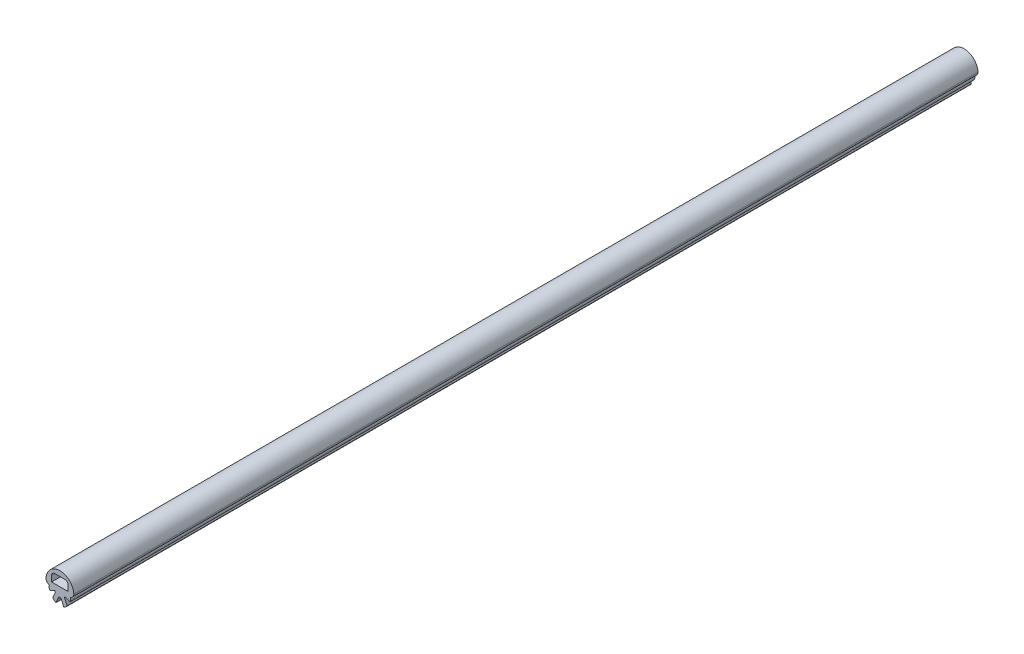
ISO-10303-21;
HEADER;
FILE_DESCRIPTION(('STEP AP214'),'2;1');
FILE_NAME('part.step','',(''),(''),'','','');
FILE_SCHEMA(('AUTOMOTIVE_DESIGN { 1 0 10303 214 1 1 1 1 }'));
ENDSEC;
DATA;
#1=APPLICATION_CONTEXT('core data for automotive mechanical design processes');
#2=APPLICATION_PROTOCOL_DEFINITION('international standard','automotive_design',2000,#1);
#3=PRODUCT_CONTEXT('',#1,'mechanical');
#4=PRODUCT('Part','Part','',(#3));
#5=PRODUCT_RELATED_PRODUCT_CATEGORY('part','',(#4));
#6=PRODUCT_DEFINITION_FORMATION('','',#4);
#7=PRODUCT_DEFINITION_CONTEXT('part definition',#1,'design');
#8=PRODUCT_DEFINITION('design','',#6,#7);
#9=PRODUCT_DEFINITION_SHAPE('','',#8);
#10=(LENGTH_UNIT() NAMED_UNIT(*) SI_UNIT(.MILLI.,.METRE.));
#11=(NAMED_UNIT(*) PLANE_ANGLE_UNIT() SI_UNIT($,.RADIAN.));
#12=(NAMED_UNIT(*) SI_UNIT($,.STERADIAN.) SOLID_ANGLE_UNIT());
#13=UNCERTAINTY_MEASURE_WITH_UNIT(LENGTH_MEASURE(1.E-05),#10,'distance_accuracy_value','');
#14=(GEOMETRIC_REPRESENTATION_CONTEXT(3) GLOBAL_UNCERTAINTY_ASSIGNED_CONTEXT((#13)) GLOBAL_UNIT_ASSIGNED_CONTEXT((#10,
#11,#12)) REPRESENTATION_CONTEXT('',''));
#15=CARTESIAN_POINT('',(0.,0.,0.));
#16=DIRECTION('',(0.,0.,1.));
#17=DIRECTION('',(1.,0.,0.));
#18=AXIS2_PLACEMENT_3D('',#15,#16,#17);
#19=CARTESIAN_POINT('',(-6.47113248654049,-11.6533832902364,17.5643148085863));
#20=DIRECTION('',(-0.866025403784436,-0.500000000000005,0.));
#21=DIRECTION('',(0.500000000000005,-0.866025403784436,0.));
#22=AXIS2_PLACEMENT_3D('',#19,#20,#21);
#23=PLANE('',#22);
#24=DIRECTION('',(0.,0.,-1.));
#25=VECTOR('',#24,1.);
#26=CARTESIAN_POINT('',(-8.95886950491573,-7.34449637854067,17.5643148085863));
#27=LINE('',#26,#25);
#28=CARTESIAN_POINT('',(-8.95886950491573,-7.34449637854067,-57.));
#29=VERTEX_POINT('',#28);
#30=CARTESIAN_POINT('',(-8.95886950491573,-7.34449637854067,-870.));
#31=VERTEX_POINT('',#30);
#32=EDGE_CURVE('E402',#29,#31,#27,.T.);
#33=ORIENTED_EDGE('',*,*,#32,.F.);
#34=DIRECTION('',(-0.500000000000005,0.866025403784436,0.));
#35=VECTOR('',#34,1.);
#36=CARTESIAN_POINT('',(-6.47113248654049,-11.6533832902364,-57.));
#37=LINE('',#36,#35);
#38=CARTESIAN_POINT('',(-9.20528257003529,-6.91769643010482,-57.));
#39=VERTEX_POINT('',#38);
#40=EDGE_CURVE('E334',#29,#39,#37,.T.);
#41=ORIENTED_EDGE('',*,*,#40,.T.);
#42=DIRECTION('',(0.,0.,-1.));
#43=VECTOR('',#42,1.);
#44=CARTESIAN_POINT('',(-9.20528257003529,-6.91769643010482,17.5643148085863));
#45=LINE('',#44,#43);
#46=CARTESIAN_POINT('',(-9.20528257003529,-6.91769643010482,-870.));
#47=VERTEX_POINT('',#46);
#48=EDGE_CURVE('E336',#39,#47,#45,.T.);
#49=ORIENTED_EDGE('',*,*,#48,.T.);
#50=DIRECTION('',(-0.500000000000005,0.866025403784436,0.));
#51=VECTOR('',#50,1.);
#52=CARTESIAN_POINT('',(-6.47113248654049,-11.6533832902364,-870.));
#53=LINE('',#52,#51);
#54=EDGE_CURVE('E373',#31,#47,#53,.T.);
#55=ORIENTED_EDGE('',*,*,#54,.F.);
#56=EDGE_LOOP('',(#33,#41,#49,#55));
#57=FACE_BOUND('',#56,.T.);
#58=ADVANCED_FACE('F49',(#57),#23,.T.);
#59=CARTESIAN_POINT('',(9.20528257003505,-6.91769643010493,17.5643148085863));
#60=DIRECTION('',(0.866025403784431,-0.500000000000013,0.));
#61=DIRECTION('',(0.500000000000013,0.866025403784431,0.));
#62=AXIS2_PLACEMENT_3D('',#59,#60,#61);
#63=PLANE('',#62);
#64=DIRECTION('',(0.,0.,1.));
#65=VECTOR('',#64,1.);
#66=CARTESIAN_POINT('',(8.95886950491558,-7.3444963785406,17.5643148085863));
#67=LINE('',#66,#65);
#68=CARTESIAN_POINT('',(8.95886950491558,-7.3444963785406,-870.));
#69=VERTEX_POINT('',#68);
#70=CARTESIAN_POINT('',(8.95886950491558,-7.3444963785406,-57.));
#71=VERTEX_POINT('',#70);
#72=EDGE_CURVE('E396',#69,#71,#67,.T.);
#73=ORIENTED_EDGE('',*,*,#72,.F.);
#74=DIRECTION('',(-0.500000000000013,-0.866025403784431,0.));
#75=VECTOR('',#74,1.);
#76=CARTESIAN_POINT('',(9.20528257003505,-6.91769643010493,-870.));
#77=LINE('',#76,#75);
#78=CARTESIAN_POINT('',(9.20528257003505,-6.91769643010492,-870.));
#79=VERTEX_POINT('',#78);
#80=EDGE_CURVE('E365',#79,#69,#77,.T.);
#81=ORIENTED_EDGE('',*,*,#80,.F.);
#82=DIRECTION('',(0.,0.,-1.));
#83=VECTOR('',#82,1.);
#84=CARTESIAN_POINT('',(9.20528257003505,-6.91769643010492,17.5643148085863));
#85=LINE('',#84,#83);
#86=CARTESIAN_POINT('',(9.20528257003505,-6.91769643010492,-57.));
#87=VERTEX_POINT('',#86);
#88=EDGE_CURVE('E322',#87,#79,#85,.T.);
#89=ORIENTED_EDGE('',*,*,#88,.F.);
#90=DIRECTION('',(-0.500000000000013,-0.866025403784431,0.));
#91=VECTOR('',#90,1.);
#92=CARTESIAN_POINT('',(9.20528257003505,-6.91769643010493,-57.));
#93=LINE('',#92,#91);
#94=EDGE_CURVE('E330',#87,#71,#93,.T.);
#95=ORIENTED_EDGE('',*,*,#94,.T.);
#96=EDGE_LOOP('',(#73,#81,#89,#95));
#97=FACE_BOUND('',#96,.T.);
#98=ADVANCED_FACE('F438',(#97),#63,.T.);
#99=CARTESIAN_POINT('',(8.50059730669662,0.499492278712982,17.5643148085863));
#100=DIRECTION('',(0.,0.,-1.));
#101=DIRECTION('',(-1.,0.,0.));
#102=AXIS2_PLACEMENT_3D('',#99,#100,#101);
#103=CYLINDRICAL_SURFACE('',#102,4.00000000000114);
#104=DIRECTION('',(0.,0.,-1.));
#105=VECTOR('',#104,1.);
#106=CARTESIAN_POINT('',(12.4961385352011,0.310679431347746,-463.5));
#107=LINE('',#106,#105);
#108=CARTESIAN_POINT('',(12.4961385352011,0.310679431347746,-57.));
#109=VERTEX_POINT('',#108);
#110=CARTESIAN_POINT('',(12.4961385352011,0.310679431347746,-870.));
#111=VERTEX_POINT('',#110);
#112=EDGE_CURVE('E343',#109,#111,#107,.T.);
#113=ORIENTED_EDGE('',*,*,#112,.F.);
#114=CARTESIAN_POINT('',(8.50059730669662,0.499492278712982,-57.));
#115=DIRECTION('',(0.,0.,1.));
#116=DIRECTION('',(1.,0.,0.));
#117=AXIS2_PLACEMENT_3D('',#114,#115,#116);
#118=CIRCLE('',#117,4.00000000000114);
#119=CARTESIAN_POINT('',(9.43762749865645,-3.38920601497925,-57.));
#120=VERTEX_POINT('',#119);
#121=EDGE_CURVE('E313',#109,#120,#118,.F.);
#122=ORIENTED_EDGE('',*,*,#121,.T.);
#123=DIRECTION('',(0.,0.,-1.));
#124=VECTOR('',#123,1.);
#125=CARTESIAN_POINT('',(9.43762749865645,-3.38920601497925,17.5643148085863));
#126=LINE('',#125,#124);
#127=CARTESIAN_POINT('',(9.43762749865645,-3.38920601497925,-870.));
#128=VERTEX_POINT('',#127);
#129=EDGE_CURVE('E318',#120,#128,#126,.T.);
#130=ORIENTED_EDGE('',*,*,#129,.T.);
#131=CARTESIAN_POINT('',(8.50059730669662,0.499492278712982,-870.));
#132=DIRECTION('',(0.,0.,-1.));
#133=DIRECTION('',(-1.,0.,0.));
#134=AXIS2_PLACEMENT_3D('',#131,#132,#133);
#135=CIRCLE('',#134,4.00000000000114);
#136=EDGE_CURVE('E359',#111,#128,#135,.T.);
#137=ORIENTED_EDGE('',*,*,#136,.F.);
#138=EDGE_LOOP('',(#113,#122,#130,#137));
#139=FACE_BOUND('',#138,.T.);
#140=ADVANCED_FACE('F445',(#139),#103,.T.);
#141=CARTESIAN_POINT('',(-8.50059730669262,0.499492278712978,17.5643148085863));
#142=DIRECTION('',(0.,0.,-1.));
#143=DIRECTION('',(-1.,0.,0.));
#144=AXIS2_PLACEMENT_3D('',#141,#142,#143);
#145=CYLINDRICAL_SURFACE('',#144,4.00000000000114);
#146=DIRECTION('',(0.,0.,-1.));
#147=VECTOR('',#146,1.);
#148=CARTESIAN_POINT('',(-12.4961385351997,0.310679431403244,-463.5));
#149=LINE('',#148,#147);
#150=CARTESIAN_POINT('',(-12.4961385351997,0.310679431403244,-870.));
#151=VERTEX_POINT('',#150);
#152=CARTESIAN_POINT('',(-12.4961385351997,0.310679431403244,-57.));
#153=VERTEX_POINT('',#152);
#154=EDGE_CURVE('E317',#151,#153,#149,.F.);
#155=ORIENTED_EDGE('',*,*,#154,.F.);
#156=CARTESIAN_POINT('',(-8.50059730669262,0.499492278712978,-870.));
#157=DIRECTION('',(0.,0.,-1.));
#158=DIRECTION('',(-1.,0.,0.));
#159=AXIS2_PLACEMENT_3D('',#156,#157,#158);
#160=CIRCLE('',#159,4.00000000000114);
#161=CARTESIAN_POINT('',(-9.43762749865635,-3.38920601497831,-870.));
#162=VERTEX_POINT('',#161);
#163=EDGE_CURVE('E347',#162,#151,#160,.T.);
#164=ORIENTED_EDGE('',*,*,#163,.F.);
#165=DIRECTION('',(0.,0.,-1.));
#166=VECTOR('',#165,1.);
#167=CARTESIAN_POINT('',(-9.43762749865635,-3.38920601497831,17.5643148085863));
#168=LINE('',#167,#166);
#169=CARTESIAN_POINT('',(-9.43762749865635,-3.38920601497831,-57.));
#170=VERTEX_POINT('',#169);
#171=EDGE_CURVE('E341',#170,#162,#168,.T.);
#172=ORIENTED_EDGE('',*,*,#171,.F.);
#173=CARTESIAN_POINT('',(-8.50059730669262,0.499492278712978,-57.));
#174=DIRECTION('',(0.,0.,1.));
#175=DIRECTION('',(1.,0.,0.));
#176=AXIS2_PLACEMENT_3D('',#173,#174,#175);
#177=CIRCLE('',#176,4.00000000000114);
#178=EDGE_CURVE('E321',#170,#153,#177,.F.);
#179=ORIENTED_EDGE('',*,*,#178,.T.);
#180=EDGE_LOOP('',(#155,#164,#172,#179));
#181=FACE_BOUND('',#180,.T.);
#182=ADVANCED_FACE('F51',(#181),#145,.T.);
#183=CARTESIAN_POINT('',(-5.49999999999569,-1.50000000000011,-870.));
#184=DIRECTION('',(0.,0.,-1.));
#185=DIRECTION('',(-1.,0.,0.));
#186=AXIS2_PLACEMENT_3D('',#183,#184,#185);
#187=PLANE('',#186);
#188=DIRECTION('',(0.,-1.,0.));
#189=VECTOR('',#188,1.);
#190=CARTESIAN_POINT('',(7.5,0.,-870.));
#191=LINE('',#190,#189);
#192=CARTESIAN_POINT('',(7.5,4.99999999999998,-870.));
#193=VERTEX_POINT('',#192);
#194=CARTESIAN_POINT('',(7.5,0.,-870.));
#195=VERTEX_POINT('',#194);
#196=EDGE_CURVE('E64',#193,#195,#191,.T.);
#197=ORIENTED_EDGE('',*,*,#196,.F.);
#198=CARTESIAN_POINT('',(4.5,5.,-870.));
#199=DIRECTION('',(0.,0.,-1.));
#200=DIRECTION('',(1.,0.,0.));
#201=AXIS2_PLACEMENT_3D('',#198,#199,#200);
#202=CIRCLE('',#201,3.);
#203=CARTESIAN_POINT('',(4.49999999999998,8.,-870.));
#204=VERTEX_POINT('',#203);
#205=EDGE_CURVE('E249',#204,#193,#202,.T.);
#206=ORIENTED_EDGE('',*,*,#205,.F.);
#207=DIRECTION('',(1.,0.,0.));
#208=VECTOR('',#207,1.);
#209=CARTESIAN_POINT('',(4.49999999999998,8.,-870.));
#210=LINE('',#209,#208);
#211=CARTESIAN_POINT('',(-4.49999999999998,8.,-870.));
#212=VERTEX_POINT('',#211);
#213=EDGE_CURVE('E243',#212,#204,#210,.T.);
#214=ORIENTED_EDGE('',*,*,#213,.F.);
#215=CARTESIAN_POINT('',(-4.5,5.,-870.));
#216=DIRECTION('',(0.,0.,-1.));
#217=DIRECTION('',(1.,0.,0.));
#218=AXIS2_PLACEMENT_3D('',#215,#216,#217);
#219=CIRCLE('',#218,3.);
#220=CARTESIAN_POINT('',(-7.5,4.99999999999998,-870.));
#221=VERTEX_POINT('',#220);
#222=EDGE_CURVE('E241',#221,#212,#219,.T.);
#223=ORIENTED_EDGE('',*,*,#222,.F.);
#224=DIRECTION('',(0.,1.,0.));
#225=VECTOR('',#224,1.);
#226=CARTESIAN_POINT('',(-7.5,0.,-870.));
#227=LINE('',#226,#225);
#228=CARTESIAN_POINT('',(-7.5,0.,-870.));
#229=VERTEX_POINT('',#228);
#230=EDGE_CURVE('E224',#229,#221,#227,.T.);
#231=ORIENTED_EDGE('',*,*,#230,.F.);
#232=DIRECTION('',(-1.,0.,0.));
#233=VECTOR('',#232,1.);
#234=CARTESIAN_POINT('',(7.5,0.,-870.));
#235=LINE('',#234,#233);
#236=EDGE_CURVE('E233',#195,#229,#235,.T.);
#237=ORIENTED_EDGE('',*,*,#236,.F.);
#238=EDGE_LOOP('',(#197,#206,#214,#223,#231,#237));
#239=FACE_BOUND('',#238,.T.);
#240=DIRECTION('',(0.910826243995696,0.412789962630747,0.));
#241=VECTOR('',#240,1.);
#242=CARTESIAN_POINT('',(-9.08644720520006,-7.40231508378774,-870.));
#243=LINE('',#242,#241);
#244=CARTESIAN_POINT('',(-4.53231598522158,-5.33836527063401,-870.));
#245=VERTEX_POINT('',#244);
#246=EDGE_CURVE('E265',#31,#245,#243,.T.);
#247=ORIENTED_EDGE('',*,*,#246,.F.);
#248=ORIENTED_EDGE('',*,*,#54,.T.);
#249=CARTESIAN_POINT('',(-5.74118095489754,-4.9176964301048,-870.));
#250=DIRECTION('',(0.,0.,-1.));
#251=DIRECTION('',(-1.,0.,0.));
#252=AXIS2_PLACEMENT_3D('',#249,#250,#251);
#253=CIRCLE('',#252,4.);
#254=EDGE_CURVE('E377',#47,#162,#253,.T.);
#255=ORIENTED_EDGE('',*,*,#254,.T.);
#256=ORIENTED_EDGE('',*,*,#163,.T.);
#257=CARTESIAN_POINT('',(0.,0.,-870.));
#258=DIRECTION('',(0.,0.,1.));
#259=DIRECTION('',(-1.,0.,0.));
#260=AXIS2_PLACEMENT_3D('',#257,#258,#259);
#261=CIRCLE('',#260,12.5);
#262=EDGE_CURVE('E383',#111,#151,#261,.T.);
#263=ORIENTED_EDGE('',*,*,#262,.F.);
#264=ORIENTED_EDGE('',*,*,#136,.T.);
#265=CARTESIAN_POINT('',(5.7411809548973,-4.91769643010491,-870.));
#266=DIRECTION('',(0.,0.,-1.));
#267=DIRECTION('',(-1.,0.,0.));
#268=AXIS2_PLACEMENT_3D('',#265,#266,#267);
#269=CIRCLE('',#268,4.);
#270=EDGE_CURVE('E361',#128,#79,#269,.T.);
#271=ORIENTED_EDGE('',*,*,#270,.T.);
#272=ORIENTED_EDGE('',*,*,#80,.T.);
#273=DIRECTION('',(0.910826243995696,-0.412789962630747,0.));
#274=VECTOR('',#273,1.);
#275=CARTESIAN_POINT('',(9.08644720520006,-7.40231508378774,-870.));
#276=LINE('',#275,#274);
#277=CARTESIAN_POINT('',(4.53231598522158,-5.33836527063401,-870.));
#278=VERTEX_POINT('',#277);
#279=EDGE_CURVE('E282',#278,#69,#276,.T.);
#280=ORIENTED_EDGE('',*,*,#279,.F.);
#281=DIRECTION('',(0.412789962630747,0.910826243995696,0.));
#282=VECTOR('',#281,1.);
#283=CARTESIAN_POINT('',(4.53231598522158,-5.33836527063401,-870.));
#284=LINE('',#283,#282);
#285=CARTESIAN_POINT('',(4.11952602259083,-6.24919151462971,-870.));
#286=VERTEX_POINT('',#285);
#287=EDGE_CURVE('E279',#286,#278,#284,.T.);
#288=ORIENTED_EDGE('',*,*,#287,.F.);
#289=DIRECTION('',(-0.408909590842513,0.912574899127194,0.));
#290=VECTOR('',#289,1.);
#291=CARTESIAN_POINT('',(4.11952602259083,-6.24919151462971,-870.));
#292=LINE('',#291,#290);
#293=CARTESIAN_POINT('',(6.51050054542626,-11.5851958120505,-870.));
#294=VERTEX_POINT('',#293);
#295=EDGE_CURVE('E276',#294,#286,#292,.T.);
#296=ORIENTED_EDGE('',*,*,#295,.F.);
#297=CARTESIAN_POINT('',(6.47113248654022,-11.6533832902365,-870.));
#298=VERTEX_POINT('',#297);
#299=EDGE_CURVE('E364',#294,#298,#77,.T.);
#300=ORIENTED_EDGE('',*,*,#299,.T.);
#301=CARTESIAN_POINT('',(1.70799276572585,-8.90338329023642,-870.));
#302=DIRECTION('',(0.,0.,-1.));
#303=DIRECTION('',(-1.,0.,0.));
#304=AXIS2_PLACEMENT_3D('',#301,#302,#303);
#305=CIRCLE('',#304,5.5);
#306=CARTESIAN_POINT('',(3.49999999999998,-14.1032592572484,-870.));
#307=VERTEX_POINT('',#306);
#308=EDGE_CURVE('E368',#298,#307,#305,.T.);
#309=ORIENTED_EDGE('',*,*,#308,.T.);
#310=DIRECTION('',(0.401668825352325,-0.915784993729469,0.));
#311=VECTOR('',#310,1.);
#312=CARTESIAN_POINT('',(-2.5880522620679,-0.222802147458822,-870.));
#313=LINE('',#312,#311);
#314=CARTESIAN_POINT('',(0.999999999999997,-8.40338329023642,-870.));
#315=VERTEX_POINT('',#314);
#316=EDGE_CURVE('E307',#315,#307,#313,.T.);
#317=ORIENTED_EDGE('',*,*,#316,.F.);
#318=DIRECTION('',(1.,0.,0.));
#319=VECTOR('',#318,1.);
#320=CARTESIAN_POINT('',(-5.49999999999569,-8.40338329023642,-870.));
#321=LINE('',#320,#319);
#322=CARTESIAN_POINT('',(-1.,-8.40338329023642,-870.));
#323=VERTEX_POINT('',#322);
#324=EDGE_CURVE('E310',#323,#315,#321,.T.);
#325=ORIENTED_EDGE('',*,*,#324,.F.);
#326=DIRECTION('',(0.401668825352324,0.91578499372947,0.));
#327=VECTOR('',#326,1.);
#328=CARTESIAN_POINT('',(0.813335964210202,-4.26906725722826,-870.));
#329=LINE('',#328,#327);
#330=CARTESIAN_POINT('',(-3.50000000000002,-14.1032592572485,-870.));
#331=VERTEX_POINT('',#330);
#332=EDGE_CURVE('E301',#331,#323,#329,.T.);
#333=ORIENTED_EDGE('',*,*,#332,.F.);
#334=CARTESIAN_POINT('',(-1.70799276572609,-8.90338329023643,-870.));
#335=DIRECTION('',(0.,0.,-1.));
#336=DIRECTION('',(-1.,0.,0.));
#337=AXIS2_PLACEMENT_3D('',#334,#335,#336);
#338=CIRCLE('',#337,5.49999999999999);
#339=CARTESIAN_POINT('',(-6.47113248654049,-11.6533832902364,-870.));
#340=VERTEX_POINT('',#339);
#341=EDGE_CURVE('E371',#331,#340,#338,.T.);
#342=ORIENTED_EDGE('',*,*,#341,.T.);
#343=CARTESIAN_POINT('',(-6.51050054542636,-11.5851958120507,-870.));
#344=VERTEX_POINT('',#343);
#345=EDGE_CURVE('E374',#340,#344,#53,.T.);
#346=ORIENTED_EDGE('',*,*,#345,.T.);
#347=DIRECTION('',(-0.408909590842513,-0.912574899127194,0.));
#348=VECTOR('',#347,1.);
#349=CARTESIAN_POINT('',(-4.11952602259083,-6.24919151462971,-870.));
#350=LINE('',#349,#348);
#351=CARTESIAN_POINT('',(-4.11952602259083,-6.24919151462971,-870.));
#352=VERTEX_POINT('',#351);
#353=EDGE_CURVE('E263',#352,#344,#350,.T.);
#354=ORIENTED_EDGE('',*,*,#353,.F.);
#355=DIRECTION('',(0.412789962630747,-0.910826243995696,0.));
#356=VECTOR('',#355,1.);
#357=CARTESIAN_POINT('',(-4.53231598522158,-5.33836527063401,-870.));
#358=LINE('',#357,#356);
#359=EDGE_CURVE('E254',#245,#352,#358,.T.);
#360=ORIENTED_EDGE('',*,*,#359,.F.);
#361=EDGE_LOOP('',(#247,#248,#255,#256,#263,#264,#271,#272,#280,#288,#296,#300,#309,#317,#325,
#333,#342,#346,#354,#360));
#362=FACE_BOUND('',#361,.T.);
#363=ADVANCED_FACE('F237',(#239,#362),#187,.T.);
#364=CARTESIAN_POINT('',(1.31751059857769E-12,4.03765428455148,-57.));
#365=DIRECTION('',(0.,0.,1.));
#366=DIRECTION('',(1.,0.,0.));
#367=AXIS2_PLACEMENT_3D('',#364,#365,#366);
#368=PLANE('',#367);
#369=DIRECTION('',(0.,1.,0.));
#370=VECTOR('',#369,1.);
#371=CARTESIAN_POINT('',(7.5,4.03765428455148,-57.));
#372=LINE('',#371,#370);
#373=CARTESIAN_POINT('',(7.5,0.,-57.));
#374=VERTEX_POINT('',#373);
#375=CARTESIAN_POINT('',(7.5,4.99999999999998,-57.));
#376=VERTEX_POINT('',#375);
#377=EDGE_CURVE('E13',#374,#376,#372,.T.);
#378=ORIENTED_EDGE('',*,*,#377,.F.);
#379=DIRECTION('',(1.,0.,0.));
#380=VECTOR('',#379,1.);
#381=CARTESIAN_POINT('',(1.31704365099934E-12,0.,-57.));
#382=LINE('',#381,#380);
#383=CARTESIAN_POINT('',(-7.5,0.,-57.));
#384=VERTEX_POINT('',#383);
#385=EDGE_CURVE('E406',#384,#374,#382,.T.);
#386=ORIENTED_EDGE('',*,*,#385,.F.);
#387=DIRECTION('',(0.,-1.,0.));
#388=VECTOR('',#387,1.);
#389=CARTESIAN_POINT('',(-7.5,4.03765428455148,-57.));
#390=LINE('',#389,#388);
#391=CARTESIAN_POINT('',(-7.5,4.99999999999998,-57.));
#392=VERTEX_POINT('',#391);
#393=EDGE_CURVE('E227',#392,#384,#390,.T.);
#394=ORIENTED_EDGE('',*,*,#393,.F.);
#395=CARTESIAN_POINT('',(-4.5,5.,-57.));
#396=DIRECTION('',(0.,0.,1.));
#397=DIRECTION('',(1.,0.,0.));
#398=AXIS2_PLACEMENT_3D('',#395,#396,#397);
#399=CIRCLE('',#398,3.);
#400=CARTESIAN_POINT('',(-4.49999999999998,8.,-57.));
#401=VERTEX_POINT('',#400);
#402=EDGE_CURVE('E409',#401,#392,#399,.T.);
#403=ORIENTED_EDGE('',*,*,#402,.F.);
#404=DIRECTION('',(-1.,0.,0.));
#405=VECTOR('',#404,1.);
#406=CARTESIAN_POINT('',(1.31827432903686E-12,8.,-57.));
#407=LINE('',#406,#405);
#408=CARTESIAN_POINT('',(4.49999999999998,8.,-57.));
#409=VERTEX_POINT('',#408);
#410=EDGE_CURVE('E411',#409,#401,#407,.T.);
#411=ORIENTED_EDGE('',*,*,#410,.F.);
#412=CARTESIAN_POINT('',(4.5,5.,-57.));
#413=DIRECTION('',(0.,0.,1.));
#414=DIRECTION('',(1.,0.,0.));
#415=AXIS2_PLACEMENT_3D('',#412,#413,#414);
#416=CIRCLE('',#415,3.);
#417=EDGE_CURVE('E57',#376,#409,#416,.T.);
#418=ORIENTED_EDGE('',*,*,#417,.F.);
#419=EDGE_LOOP('',(#378,#386,#394,#403,#411,#418));
#420=FACE_BOUND('',#419,.T.);
#421=DIRECTION('',(-0.910826243995696,-0.412789962630747,0.));
#422=VECTOR('',#421,1.);
#423=CARTESIAN_POINT('',(2.75290869769695,-2.03667337885675,-57.));
#424=LINE('',#423,#422);
#425=CARTESIAN_POINT('',(-4.53231598522158,-5.33836527063401,-57.));
#426=VERTEX_POINT('',#425);
#427=EDGE_CURVE('E274',#426,#29,#424,.T.);
#428=ORIENTED_EDGE('',*,*,#427,.F.);
#429=DIRECTION('',(-0.412789962630747,0.910826243995696,0.));
#430=VECTOR('',#429,1.);
#431=CARTESIAN_POINT('',(-7.28522468291721,0.735962392774212,-57.));
#432=LINE('',#431,#430);
#433=CARTESIAN_POINT('',(-4.11952602259083,-6.24919151462971,-57.));
#434=VERTEX_POINT('',#433);
#435=EDGE_CURVE('E404',#434,#426,#432,.T.);
#436=ORIENTED_EDGE('',*,*,#435,.F.);
#437=DIRECTION('',(0.408909590842513,0.912574899127194,0.));
#438=VECTOR('',#437,1.);
#439=CARTESIAN_POINT('',(0.407933630283887,3.85486602902387,-57.));
#440=LINE('',#439,#438);
#441=CARTESIAN_POINT('',(-6.51050054542636,-11.5851958120507,-57.));
#442=VERTEX_POINT('',#441);
#443=EDGE_CURVE('E271',#442,#434,#440,.T.);
#444=ORIENTED_EDGE('',*,*,#443,.F.);
#445=CARTESIAN_POINT('',(-6.47113248654049,-11.6533832902364,-57.));
#446=VERTEX_POINT('',#445);
#447=EDGE_CURVE('E340',#446,#442,#37,.T.);
#448=ORIENTED_EDGE('',*,*,#447,.F.);
#449=CARTESIAN_POINT('',(-1.70799276572609,-8.90338329023643,-57.));
#450=DIRECTION('',(0.,0.,1.));
#451=DIRECTION('',(1.,0.,0.));
#452=AXIS2_PLACEMENT_3D('',#449,#450,#451);
#453=CIRCLE('',#452,5.49999999999999);
#454=CARTESIAN_POINT('',(-3.50000000000002,-14.1032592572485,-57.));
#455=VERTEX_POINT('',#454);
#456=EDGE_CURVE('E335',#455,#446,#453,.F.);
#457=ORIENTED_EDGE('',*,*,#456,.F.);
#458=DIRECTION('',(-0.401668825352324,-0.91578499372947,0.));
#459=VECTOR('',#458,1.);
#460=CARTESIAN_POINT('',(3.7376775060087,2.39828637214464,-57.));
#461=LINE('',#460,#459);
#462=CARTESIAN_POINT('',(-1.,-8.40338329023642,-57.));
#463=VERTEX_POINT('',#462);
#464=EDGE_CURVE('E298',#463,#455,#461,.T.);
#465=ORIENTED_EDGE('',*,*,#464,.F.);
#466=DIRECTION('',(-1.,0.,0.));
#467=VECTOR('',#466,1.);
#468=CARTESIAN_POINT('',(1.31751059857769E-12,-8.40338329023642,-57.));
#469=LINE('',#468,#467);
#470=CARTESIAN_POINT('',(0.999999999999997,-8.40338329023642,-57.));
#471=VERTEX_POINT('',#470);
#472=EDGE_CURVE('E391',#471,#463,#469,.T.);
#473=ORIENTED_EDGE('',*,*,#472,.F.);
#474=DIRECTION('',(-0.401668825352325,0.915784993729469,0.));
#475=VECTOR('',#474,1.);
#476=CARTESIAN_POINT('',(-3.73767750600829,2.39828637214366,-57.));
#477=LINE('',#476,#475);
#478=CARTESIAN_POINT('',(3.49999999999998,-14.1032592572484,-57.));
#479=VERTEX_POINT('',#478);
#480=EDGE_CURVE('E304',#479,#471,#477,.T.);
#481=ORIENTED_EDGE('',*,*,#480,.F.);
#482=CARTESIAN_POINT('',(1.70799276572585,-8.90338329023642,-57.));
#483=DIRECTION('',(0.,0.,1.));
#484=DIRECTION('',(1.,0.,0.));
#485=AXIS2_PLACEMENT_3D('',#482,#483,#484);
#486=CIRCLE('',#485,5.5);
#487=CARTESIAN_POINT('',(6.47113248654023,-11.6533832902365,-57.));
#488=VERTEX_POINT('',#487);
#489=EDGE_CURVE('E329',#488,#479,#486,.F.);
#490=ORIENTED_EDGE('',*,*,#489,.F.);
#491=CARTESIAN_POINT('',(6.51050054542626,-11.5851958120505,-57.));
#492=VERTEX_POINT('',#491);
#493=EDGE_CURVE('E324',#492,#488,#93,.T.);
#494=ORIENTED_EDGE('',*,*,#493,.F.);
#495=DIRECTION('',(0.408909590842513,-0.912574899127194,0.));
#496=VECTOR('',#495,1.);
#497=CARTESIAN_POINT('',(-0.407933630283447,3.85486602902288,-57.));
#498=LINE('',#497,#496);
#499=CARTESIAN_POINT('',(4.11952602259083,-6.24919151462971,-57.));
#500=VERTEX_POINT('',#499);
#501=EDGE_CURVE('E287',#500,#492,#498,.T.);
#502=ORIENTED_EDGE('',*,*,#501,.F.);
#503=DIRECTION('',(-0.412789962630747,-0.910826243995696,0.));
#504=VECTOR('',#503,1.);
#505=CARTESIAN_POINT('',(7.28522468291765,0.735962392775203,-57.));
#506=LINE('',#505,#504);
#507=CARTESIAN_POINT('',(4.53231598522158,-5.33836527063401,-57.));
#508=VERTEX_POINT('',#507);
#509=EDGE_CURVE('E398',#508,#500,#506,.T.);
#510=ORIENTED_EDGE('',*,*,#509,.F.);
#511=DIRECTION('',(-0.910826243995696,0.412789962630747,0.));
#512=VECTOR('',#511,1.);
#513=CARTESIAN_POINT('',(-2.75290869769476,-2.03667337885774,-57.));
#514=LINE('',#513,#512);
#515=EDGE_CURVE('E290',#71,#508,#514,.T.);
#516=ORIENTED_EDGE('',*,*,#515,.F.);
#517=ORIENTED_EDGE('',*,*,#94,.F.);
#518=CARTESIAN_POINT('',(5.7411809548973,-4.91769643010491,-57.));
#519=DIRECTION('',(0.,0.,1.));
#520=DIRECTION('',(1.,0.,0.));
#521=AXIS2_PLACEMENT_3D('',#518,#519,#520);
#522=CIRCLE('',#521,4.);
#523=EDGE_CURVE('E325',#120,#87,#522,.F.);
#524=ORIENTED_EDGE('',*,*,#523,.F.);
#525=ORIENTED_EDGE('',*,*,#121,.F.);
#526=CARTESIAN_POINT('',(0.,0.,-57.));
#527=DIRECTION('',(0.,0.,1.));
#528=DIRECTION('',(1.,0.,0.));
#529=AXIS2_PLACEMENT_3D('',#526,#527,#528);
#530=CIRCLE('',#529,12.5);
#531=EDGE_CURVE('E314',#153,#109,#530,.F.);
#532=ORIENTED_EDGE('',*,*,#531,.F.);
#533=ORIENTED_EDGE('',*,*,#178,.F.);
#534=CARTESIAN_POINT('',(-5.74118095489754,-4.9176964301048,-57.));
#535=DIRECTION('',(0.,0.,1.));
#536=DIRECTION('',(1.,0.,0.));
#537=AXIS2_PLACEMENT_3D('',#534,#535,#536);
#538=CIRCLE('',#537,4.);
#539=EDGE_CURVE('E339',#39,#170,#538,.F.);
#540=ORIENTED_EDGE('',*,*,#539,.F.);
#541=ORIENTED_EDGE('',*,*,#40,.F.);
#542=EDGE_LOOP('',(#428,#436,#444,#448,#457,#465,#473,#481,#490,#494,#502,#510,#516,#517,#524,
#525,#532,#533,#540,#541));
#543=FACE_BOUND('',#542,.T.);
#544=ADVANCED_FACE('F425',(#420,#543),#368,.T.);
#545=CARTESIAN_POINT('',(5.7411809548973,-4.91769643010491,17.5643148085863));
#546=DIRECTION('',(0.,0.,-1.));
#547=DIRECTION('',(-1.,0.,0.));
#548=AXIS2_PLACEMENT_3D('',#545,#546,#547);
#549=CYLINDRICAL_SURFACE('',#548,4.);
#550=ORIENTED_EDGE('',*,*,#129,.F.);
#551=ORIENTED_EDGE('',*,*,#523,.T.);
#552=ORIENTED_EDGE('',*,*,#88,.T.);
#553=ORIENTED_EDGE('',*,*,#270,.F.);
#554=EDGE_LOOP('',(#550,#551,#552,#553));
#555=FACE_BOUND('',#554,.T.);
#556=ADVANCED_FACE('F505',(#555),#549,.T.);
#557=DIRECTION('',(0.,0.,-1.));
#558=VECTOR('',#557,1.);
#559=CARTESIAN_POINT('',(6.51050054542626,-11.5851958120505,17.5643148085863));
#560=LINE('',#559,#558);
#561=EDGE_CURVE('E394',#492,#294,#560,.T.);
#562=ORIENTED_EDGE('',*,*,#561,.F.);
#563=ORIENTED_EDGE('',*,*,#493,.T.);
#564=DIRECTION('',(0.,0.,-1.));
#565=VECTOR('',#564,1.);
#566=CARTESIAN_POINT('',(6.47113248654022,-11.6533832902365,17.5643148085863));
#567=LINE('',#566,#565);
#568=EDGE_CURVE('E326',#488,#298,#567,.T.);
#569=ORIENTED_EDGE('',*,*,#568,.T.);
#570=ORIENTED_EDGE('',*,*,#299,.F.);
#571=EDGE_LOOP('',(#562,#563,#569,#570));
#572=FACE_BOUND('',#571,.T.);
#573=ADVANCED_FACE('F448',(#572),#63,.T.);
#574=CARTESIAN_POINT('',(1.70799276572585,-8.90338329023642,17.5643148085863));
#575=DIRECTION('',(0.,0.,-1.));
#576=DIRECTION('',(-1.,0.,0.));
#577=AXIS2_PLACEMENT_3D('',#574,#575,#576);
#578=CYLINDRICAL_SURFACE('',#577,5.5);
#579=DIRECTION('',(0.,0.,-1.));
#580=VECTOR('',#579,1.);
#581=CARTESIAN_POINT('',(3.49999999999998,-14.1032592572484,17.5643148085863));
#582=LINE('',#581,#580);
#583=EDGE_CURVE('E388',#307,#479,#582,.F.);
#584=ORIENTED_EDGE('',*,*,#583,.F.);
#585=ORIENTED_EDGE('',*,*,#308,.F.);
#586=ORIENTED_EDGE('',*,*,#568,.F.);
#587=ORIENTED_EDGE('',*,*,#489,.T.);
#588=EDGE_LOOP('',(#584,#585,#586,#587));
#589=FACE_BOUND('',#588,.T.);
#590=ADVANCED_FACE('F462',(#589),#578,.T.);
#591=CARTESIAN_POINT('',(-1.70799276572609,-8.90338329023643,17.5643148085863));
#592=DIRECTION('',(0.,0.,-1.));
#593=DIRECTION('',(-1.,0.,0.));
#594=AXIS2_PLACEMENT_3D('',#591,#592,#593);
#595=CYLINDRICAL_SURFACE('',#594,5.49999999999999);
#596=DIRECTION('',(0.,0.,-1.));
#597=VECTOR('',#596,1.);
#598=CARTESIAN_POINT('',(-3.50000000000002,-14.1032592572485,17.5643148085863));
#599=LINE('',#598,#597);
#600=EDGE_CURVE('E316',#455,#331,#599,.T.);
#601=ORIENTED_EDGE('',*,*,#600,.F.);
#602=ORIENTED_EDGE('',*,*,#456,.T.);
#603=DIRECTION('',(0.,0.,-1.));
#604=VECTOR('',#603,1.);
#605=CARTESIAN_POINT('',(-6.47113248654049,-11.6533832902364,17.5643148085863));
#606=LINE('',#605,#604);
#607=EDGE_CURVE('E331',#446,#340,#606,.T.);
#608=ORIENTED_EDGE('',*,*,#607,.T.);
#609=ORIENTED_EDGE('',*,*,#341,.F.);
#610=EDGE_LOOP('',(#601,#602,#608,#609));
#611=FACE_BOUND('',#610,.T.);
#612=ADVANCED_FACE('F454',(#611),#595,.T.);
#613=DIRECTION('',(0.,0.,1.));
#614=VECTOR('',#613,1.);
#615=CARTESIAN_POINT('',(-6.51050054542636,-11.5851958120507,17.5643148085863));
#616=LINE('',#615,#614);
#617=EDGE_CURVE('E400',#344,#442,#616,.T.);
#618=ORIENTED_EDGE('',*,*,#617,.F.);
#619=ORIENTED_EDGE('',*,*,#345,.F.);
#620=ORIENTED_EDGE('',*,*,#607,.F.);
#621=ORIENTED_EDGE('',*,*,#447,.T.);
#622=EDGE_LOOP('',(#618,#619,#620,#621));
#623=FACE_BOUND('',#622,.T.);
#624=ADVANCED_FACE('F441',(#623),#23,.T.);
#625=CARTESIAN_POINT('',(-5.74118095489754,-4.9176964301048,17.5643148085863));
#626=DIRECTION('',(0.,0.,-1.));
#627=DIRECTION('',(-1.,0.,0.));
#628=AXIS2_PLACEMENT_3D('',#625,#626,#627);
#629=CYLINDRICAL_SURFACE('',#628,4.);
#630=ORIENTED_EDGE('',*,*,#48,.F.);
#631=ORIENTED_EDGE('',*,*,#539,.T.);
#632=ORIENTED_EDGE('',*,*,#171,.T.);
#633=ORIENTED_EDGE('',*,*,#254,.F.);
#634=EDGE_LOOP('',(#630,#631,#632,#633));
#635=FACE_BOUND('',#634,.T.);
#636=ADVANCED_FACE('F453',(#635),#629,.T.);
#637=CARTESIAN_POINT('',(0.,0.,-57.));
#638=DIRECTION('',(0.,0.,-1.));
#639=DIRECTION('',(-1.,0.,0.));
#640=AXIS2_PLACEMENT_3D('',#637,#638,#639);
#641=CYLINDRICAL_SURFACE('',#640,12.5);
#642=ORIENTED_EDGE('',*,*,#112,.T.);
#643=ORIENTED_EDGE('',*,*,#262,.T.);
#644=ORIENTED_EDGE('',*,*,#154,.T.);
#645=ORIENTED_EDGE('',*,*,#531,.T.);
#646=EDGE_LOOP('',(#642,#643,#644,#645));
#647=FACE_BOUND('',#646,.T.);
#648=ADVANCED_FACE('F460',(#647),#641,.T.);
#649=CARTESIAN_POINT('',(0.999999999999997,-8.40338329023642,-2903.54706097183));
#650=DIRECTION('',(0.915784993729469,0.401668825352325,0.));
#651=DIRECTION('',(-0.401668825352325,0.915784993729469,0.));
#652=AXIS2_PLACEMENT_3D('',#649,#650,#651);
#653=PLANE('',#652);
#654=DIRECTION('',(0.,0.,1.));
#655=VECTOR('',#654,1.);
#656=CARTESIAN_POINT('',(0.999999999999997,-8.40338329023642,-2903.54706097183));
#657=LINE('',#656,#655);
#658=EDGE_CURVE('E295',#315,#471,#657,.T.);
#659=ORIENTED_EDGE('',*,*,#658,.F.);
#660=ORIENTED_EDGE('',*,*,#316,.T.);
#661=ORIENTED_EDGE('',*,*,#583,.T.);
#662=ORIENTED_EDGE('',*,*,#480,.T.);
#663=EDGE_LOOP('',(#659,#660,#661,#662));
#664=FACE_BOUND('',#663,.T.);
#665=ADVANCED_FACE('F531',(#664),#653,.F.);
#666=CARTESIAN_POINT('',(0.999999999999997,-8.40338329023642,-2903.54706097183));
#667=DIRECTION('',(0.,1.,0.));
#668=DIRECTION('',(0.,0.,1.));
#669=AXIS2_PLACEMENT_3D('',#666,#667,#668);
#670=PLANE('',#669);
#671=DIRECTION('',(0.,0.,1.));
#672=VECTOR('',#671,1.);
#673=CARTESIAN_POINT('',(-1.,-8.40338329023642,-2903.54706097183));
#674=LINE('',#673,#672);
#675=EDGE_CURVE('E292',#323,#463,#674,.T.);
#676=ORIENTED_EDGE('',*,*,#675,.F.);
#677=ORIENTED_EDGE('',*,*,#324,.T.);
#678=ORIENTED_EDGE('',*,*,#658,.T.);
#679=ORIENTED_EDGE('',*,*,#472,.T.);
#680=EDGE_LOOP('',(#676,#677,#678,#679));
#681=FACE_BOUND('',#680,.T.);
#682=ADVANCED_FACE('F534',(#681),#670,.F.);
#683=CARTESIAN_POINT('',(-1.,-8.40338329023642,-2903.54706097183));
#684=DIRECTION('',(-0.915784993729469,0.401668825352324,0.));
#685=DIRECTION('',(-0.401668825352324,-0.91578499372947,0.));
#686=AXIS2_PLACEMENT_3D('',#683,#684,#685);
#687=PLANE('',#686);
#688=ORIENTED_EDGE('',*,*,#600,.T.);
#689=ORIENTED_EDGE('',*,*,#332,.T.);
#690=ORIENTED_EDGE('',*,*,#675,.T.);
#691=ORIENTED_EDGE('',*,*,#464,.T.);
#692=EDGE_LOOP('',(#688,#689,#690,#691));
#693=FACE_BOUND('',#692,.T.);
#694=ADVANCED_FACE('F536',(#693),#687,.F.);
#695=CARTESIAN_POINT('',(9.08644720520006,-7.40231508378774,-56.9958631723143));
#696=DIRECTION('',(0.412789962630747,0.910826243995696,0.));
#697=DIRECTION('',(-0.910826243995696,0.412789962630747,0.));
#698=AXIS2_PLACEMENT_3D('',#695,#696,#697);
#699=PLANE('',#698);
#700=ORIENTED_EDGE('',*,*,#515,.T.);
#701=DIRECTION('',(0.,0.,-1.));
#702=VECTOR('',#701,1.);
#703=CARTESIAN_POINT('',(4.53231598522158,-5.33836527063401,-56.9958631723143));
#704=LINE('',#703,#702);
#705=EDGE_CURVE('E285',#508,#278,#704,.T.);
#706=ORIENTED_EDGE('',*,*,#705,.T.);
#707=ORIENTED_EDGE('',*,*,#279,.T.);
#708=ORIENTED_EDGE('',*,*,#72,.T.);
#709=EDGE_LOOP('',(#700,#706,#707,#708));
#710=FACE_BOUND('',#709,.T.);
#711=ADVANCED_FACE('F510',(#710),#699,.F.);
#712=CARTESIAN_POINT('',(4.53231598522158,-5.33836527063401,-56.9958631723143));
#713=DIRECTION('',(-0.910826243995696,0.412789962630747,0.));
#714=DIRECTION('',(-0.412789962630747,-0.910826243995696,0.));
#715=AXIS2_PLACEMENT_3D('',#712,#713,#714);
#716=PLANE('',#715);
#717=ORIENTED_EDGE('',*,*,#509,.T.);
#718=DIRECTION('',(0.,0.,-1.));
#719=VECTOR('',#718,1.);
#720=CARTESIAN_POINT('',(4.11952602259083,-6.24919151462971,-56.9958631723143));
#721=LINE('',#720,#719);
#722=EDGE_CURVE('E284',#500,#286,#721,.T.);
#723=ORIENTED_EDGE('',*,*,#722,.T.);
#724=ORIENTED_EDGE('',*,*,#287,.T.);
#725=ORIENTED_EDGE('',*,*,#705,.F.);
#726=EDGE_LOOP('',(#717,#723,#724,#725));
#727=FACE_BOUND('',#726,.T.);
#728=ADVANCED_FACE('F517',(#727),#716,.F.);
#729=CARTESIAN_POINT('',(4.11952602259083,-6.24919151462971,-56.9958631723143));
#730=DIRECTION('',(-0.912574899127194,-0.408909590842513,0.));
#731=DIRECTION('',(0.408909590842513,-0.912574899127194,0.));
#732=AXIS2_PLACEMENT_3D('',#729,#730,#731);
#733=PLANE('',#732);
#734=ORIENTED_EDGE('',*,*,#501,.T.);
#735=ORIENTED_EDGE('',*,*,#561,.T.);
#736=ORIENTED_EDGE('',*,*,#295,.T.);
#737=ORIENTED_EDGE('',*,*,#722,.F.);
#738=EDGE_LOOP('',(#734,#735,#736,#737));
#739=FACE_BOUND('',#738,.T.);
#740=ADVANCED_FACE('F519',(#739),#733,.F.);
#741=CARTESIAN_POINT('',(-4.53231598522158,-5.33836527063401,-56.9958631723143));
#742=DIRECTION('',(0.910826243995696,0.412789962630747,0.));
#743=DIRECTION('',(-0.412789962630747,0.910826243995696,0.));
#744=AXIS2_PLACEMENT_3D('',#741,#742,#743);
#745=PLANE('',#744);
#746=ORIENTED_EDGE('',*,*,#435,.T.);
#747=DIRECTION('',(0.,0.,-1.));
#748=VECTOR('',#747,1.);
#749=CARTESIAN_POINT('',(-4.53231598522158,-5.33836527063401,-56.9958631723143));
#750=LINE('',#749,#748);
#751=EDGE_CURVE('E269',#426,#245,#750,.T.);
#752=ORIENTED_EDGE('',*,*,#751,.T.);
#753=ORIENTED_EDGE('',*,*,#359,.T.);
#754=DIRECTION('',(0.,0.,-1.));
#755=VECTOR('',#754,1.);
#756=CARTESIAN_POINT('',(-4.11952602259083,-6.24919151462971,-56.9958631723143));
#757=LINE('',#756,#755);
#758=EDGE_CURVE('E268',#434,#352,#757,.T.);
#759=ORIENTED_EDGE('',*,*,#758,.F.);
#760=EDGE_LOOP('',(#746,#752,#753,#759));
#761=FACE_BOUND('',#760,.T.);
#762=ADVANCED_FACE('F480',(#761),#745,.F.);
#763=CARTESIAN_POINT('',(-9.08644720520006,-7.40231508378774,-56.9958631723143));
#764=DIRECTION('',(-0.412789962630747,0.910826243995696,0.));
#765=DIRECTION('',(-0.910826243995696,-0.412789962630747,0.));
#766=AXIS2_PLACEMENT_3D('',#763,#764,#765);
#767=PLANE('',#766);
#768=ORIENTED_EDGE('',*,*,#427,.T.);
#769=ORIENTED_EDGE('',*,*,#32,.T.);
#770=ORIENTED_EDGE('',*,*,#246,.T.);
#771=ORIENTED_EDGE('',*,*,#751,.F.);
#772=EDGE_LOOP('',(#768,#769,#770,#771));
#773=FACE_BOUND('',#772,.T.);
#774=ADVANCED_FACE('F635',(#773),#767,.F.);
#775=CARTESIAN_POINT('',(-4.11952602259083,-6.24919151462971,-56.9958631723143));
#776=DIRECTION('',(0.912574899127194,-0.408909590842513,0.));
#777=DIRECTION('',(0.408909590842513,0.912574899127194,0.));
#778=AXIS2_PLACEMENT_3D('',#775,#776,#777);
#779=PLANE('',#778);
#780=ORIENTED_EDGE('',*,*,#443,.T.);
#781=ORIENTED_EDGE('',*,*,#758,.T.);
#782=ORIENTED_EDGE('',*,*,#353,.T.);
#783=ORIENTED_EDGE('',*,*,#617,.T.);
#784=EDGE_LOOP('',(#780,#781,#782,#783));
#785=FACE_BOUND('',#784,.T.);
#786=ADVANCED_FACE('F478',(#785),#779,.F.);
#787=CARTESIAN_POINT('',(7.5,0.,-56.9958631723143));
#788=DIRECTION('',(1.,0.,0.));
#789=DIRECTION('',(0.,0.,-1.));
#790=AXIS2_PLACEMENT_3D('',#787,#788,#789);
#791=PLANE('',#790);
#792=ORIENTED_EDGE('',*,*,#377,.T.);
#793=DIRECTION('',(0.,0.,-1.));
#794=VECTOR('',#793,1.);
#795=CARTESIAN_POINT('',(7.5,4.99999999999998,-56.9958631723143));
#796=LINE('',#795,#794);
#797=EDGE_CURVE('E252',#376,#193,#796,.T.);
#798=ORIENTED_EDGE('',*,*,#797,.T.);
#799=ORIENTED_EDGE('',*,*,#196,.T.);
#800=DIRECTION('',(0.,0.,-1.));
#801=VECTOR('',#800,1.);
#802=CARTESIAN_POINT('',(7.5,0.,-56.9958631723143));
#803=LINE('',#802,#801);
#804=EDGE_CURVE('E230',#374,#195,#803,.T.);
#805=ORIENTED_EDGE('',*,*,#804,.F.);
#806=EDGE_LOOP('',(#792,#798,#799,#805));
#807=FACE_BOUND('',#806,.T.);
#808=ADVANCED_FACE('F652',(#807),#791,.F.);
#809=CARTESIAN_POINT('',(4.5,5.,-56.9958631723143));
#810=DIRECTION('',(0.,0.,-1.));
#811=DIRECTION('',(-1.,0.,0.));
#812=AXIS2_PLACEMENT_3D('',#809,#810,#811);
#813=CYLINDRICAL_SURFACE('',#812,3.);
#814=ORIENTED_EDGE('',*,*,#417,.T.);
#815=DIRECTION('',(0.,0.,-1.));
#816=VECTOR('',#815,1.);
#817=CARTESIAN_POINT('',(4.49999999999998,8.,-56.9958631723143));
#818=LINE('',#817,#816);
#819=EDGE_CURVE('E255',#409,#204,#818,.T.);
#820=ORIENTED_EDGE('',*,*,#819,.T.);
#821=ORIENTED_EDGE('',*,*,#205,.T.);
#822=ORIENTED_EDGE('',*,*,#797,.F.);
#823=EDGE_LOOP('',(#814,#820,#821,#822));
#824=FACE_BOUND('',#823,.T.);
#825=ADVANCED_FACE('F416',(#824),#813,.F.);
#826=CARTESIAN_POINT('',(4.49999999999998,8.,-56.9958631723143));
#827=DIRECTION('',(0.,1.,0.));
#828=DIRECTION('',(-1.,0.,0.));
#829=AXIS2_PLACEMENT_3D('',#826,#827,#828);
#830=PLANE('',#829);
#831=ORIENTED_EDGE('',*,*,#410,.T.);
#832=DIRECTION('',(0.,0.,-1.));
#833=VECTOR('',#832,1.);
#834=CARTESIAN_POINT('',(-4.49999999999998,8.,-56.9958631723143));
#835=LINE('',#834,#833);
#836=EDGE_CURVE('E257',#401,#212,#835,.T.);
#837=ORIENTED_EDGE('',*,*,#836,.T.);
#838=ORIENTED_EDGE('',*,*,#213,.T.);
#839=ORIENTED_EDGE('',*,*,#819,.F.);
#840=EDGE_LOOP('',(#831,#837,#838,#839));
#841=FACE_BOUND('',#840,.T.);
#842=ADVANCED_FACE('F421',(#841),#830,.F.);
#843=CARTESIAN_POINT('',(-4.5,5.,-56.9958631723143));
#844=DIRECTION('',(0.,0.,-1.));
#845=DIRECTION('',(-1.,0.,0.));
#846=AXIS2_PLACEMENT_3D('',#843,#844,#845);
#847=CYLINDRICAL_SURFACE('',#846,3.);
#848=ORIENTED_EDGE('',*,*,#402,.T.);
#849=DIRECTION('',(0.,0.,-1.));
#850=VECTOR('',#849,1.);
#851=CARTESIAN_POINT('',(-7.5,4.99999999999998,-56.9958631723143));
#852=LINE('',#851,#850);
#853=EDGE_CURVE('E229',#392,#221,#852,.T.);
#854=ORIENTED_EDGE('',*,*,#853,.T.);
#855=ORIENTED_EDGE('',*,*,#222,.T.);
#856=ORIENTED_EDGE('',*,*,#836,.F.);
#857=EDGE_LOOP('',(#848,#854,#855,#856));
#858=FACE_BOUND('',#857,.T.);
#859=ADVANCED_FACE('F428',(#858),#847,.F.);
#860=CARTESIAN_POINT('',(-7.5,0.,-56.9958631723143));
#861=DIRECTION('',(-1.,0.,0.));
#862=DIRECTION('',(0.,-1.,0.));
#863=AXIS2_PLACEMENT_3D('',#860,#861,#862);
#864=PLANE('',#863);
#865=ORIENTED_EDGE('',*,*,#393,.T.);
#866=DIRECTION('',(0.,0.,-1.));
#867=VECTOR('',#866,1.);
#868=CARTESIAN_POINT('',(-7.5,0.,-56.9958631723143));
#869=LINE('',#868,#867);
#870=EDGE_CURVE('E72',#384,#229,#869,.T.);
#871=ORIENTED_EDGE('',*,*,#870,.T.);
#872=ORIENTED_EDGE('',*,*,#230,.T.);
#873=ORIENTED_EDGE('',*,*,#853,.F.);
#874=EDGE_LOOP('',(#865,#871,#872,#873));
#875=FACE_BOUND('',#874,.T.);
#876=ADVANCED_FACE('F221',(#875),#864,.F.);
#877=CARTESIAN_POINT('',(7.5,0.,-56.9958631723143));
#878=DIRECTION('',(0.,-1.,0.));
#879=DIRECTION('',(1.,0.,0.));
#880=AXIS2_PLACEMENT_3D('',#877,#878,#879);
#881=PLANE('',#880);
#882=ORIENTED_EDGE('',*,*,#385,.T.);
#883=ORIENTED_EDGE('',*,*,#804,.T.);
#884=ORIENTED_EDGE('',*,*,#236,.T.);
#885=ORIENTED_EDGE('',*,*,#870,.F.);
#886=EDGE_LOOP('',(#882,#883,#884,#885));
#887=FACE_BOUND('',#886,.T.);
#888=ADVANCED_FACE('F234',(#887),#881,.F.);
#889=CLOSED_SHELL('',(#58,#98,#140,#182,#363,#544,#556,#573,#590,#612,#624,#636,#648,#665,#682,
#694,#711,#728,#740,#762,#774,#786,#808,#825,#842,#859,#876,#888));
#890=MANIFOLD_SOLID_BREP('B2',#889);
#891=CARTESIAN_POINT('',(-8.50059730669262,0.499492278712978,17.5643148085863));
#892=DIRECTION('',(0.,0.,-1.));
#893=DIRECTION('',(-1.,0.,0.));
#894=AXIS2_PLACEMENT_3D('',#891,#892,#893);
#895=CYLINDRICAL_SURFACE('',#894,4.00000000000114);
#896=DIRECTION('',(0.,0.,-1.));
#897=VECTOR('',#896,1.);
#898=CARTESIAN_POINT('',(-12.5,0.430368500063479,17.5643148085863));
#899=LINE('',#898,#897);
#900=CARTESIAN_POINT('',(-12.5,0.430368500063602,-57.));
#901=VERTEX_POINT('',#900);
#902=CARTESIAN_POINT('',(-12.5,0.430368500063602,-870.));
#903=VERTEX_POINT('',#902);
#904=EDGE_CURVE('E767',#901,#903,#899,.T.);
#905=ORIENTED_EDGE('',*,*,#904,.F.);
#906=CARTESIAN_POINT('',(-8.50059730669262,0.499492278712978,-57.));
#907=DIRECTION('',(0.,0.,-1.));
#908=DIRECTION('',(-0.999850673326561,-0.0172809446623392,0.));
#909=AXIS2_PLACEMENT_3D('',#906,#907,#908);
#910=CIRCLE('',#909,4.00000000000114);
#911=CARTESIAN_POINT('',(-12.4999999999969,0.56861605754354,-57.));
#912=VERTEX_POINT('',#911);
#913=EDGE_CURVE('E781',#901,#912,#910,.T.);
#914=ORIENTED_EDGE('',*,*,#913,.T.);
#915=DIRECTION('',(0.,0.,-1.));
#916=VECTOR('',#915,1.);
#917=CARTESIAN_POINT('',(-12.4999999999969,0.56861605754354,17.5643148085863));
#918=LINE('',#917,#916);
#919=CARTESIAN_POINT('',(-12.5,0.568616057362359,-870.));
#920=VERTEX_POINT('',#919);
#921=EDGE_CURVE('E779',#912,#920,#918,.T.);
#922=ORIENTED_EDGE('',*,*,#921,.T.);
#923=CARTESIAN_POINT('',(-12.5,0.43036850006363,-870.));
#924=DIRECTION('',(0.,1.,0.));
#925=VECTOR('',#924,1.);
#926=LINE('',#923,#925);
#927=EDGE_CURVE('E47',#903,#920,#926,.T.);
#928=ORIENTED_EDGE('',*,*,#927,.F.);
#929=EDGE_LOOP('',(#905,#914,#922,#928));
#930=FACE_BOUND('',#929,.T.);
#931=ADVANCED_FACE('F756',(#930),#895,.T.);
#932=CARTESIAN_POINT('',(-12.5,64.7247281914342,-57.));
#933=DIRECTION('',(-1.,0.,0.));
#934=DIRECTION('',(0.,0.,1.));
#935=AXIS2_PLACEMENT_3D('',#932,#933,#934);
#936=PLANE('',#935);
#937=ORIENTED_EDGE('',*,*,#921,.F.);
#938=ORIENTED_EDGE('',*,*,#913,.F.);
#939=ORIENTED_EDGE('',*,*,#904,.T.);
#940=ORIENTED_EDGE('',*,*,#927,.T.);
#941=EDGE_LOOP('',(#937,#938,#939,#940));
#942=FACE_BOUND('',#941,.T.);
#943=ADVANCED_FACE('F758',(#942),#936,.F.);
#944=CLOSED_SHELL('',(#931,#943));
#945=MANIFOLD_SOLID_BREP('B7',#944);
#946=CARTESIAN_POINT('',(8.50059730669662,0.499492278712982,17.5643148085863));
#947=DIRECTION('',(0.,0.,-1.));
#948=DIRECTION('',(-1.,0.,0.));
#949=AXIS2_PLACEMENT_3D('',#946,#947,#948);
#950=CYLINDRICAL_SURFACE('',#949,4.00000000000114);
#951=DIRECTION('',(0.,0.,-1.));
#952=VECTOR('',#951,1.);
#953=CARTESIAN_POINT('',(12.5,0.430368499831958,17.5643148085863));
#954=LINE('',#953,#952);
#955=CARTESIAN_POINT('',(12.5,0.430368499832056,-870.));
#956=VERTEX_POINT('',#955);
#957=CARTESIAN_POINT('',(12.5,0.430368499832056,-57.));
#958=VERTEX_POINT('',#957);
#959=EDGE_CURVE('E859',#956,#958,#954,.F.);
#960=ORIENTED_EDGE('',*,*,#959,.F.);
#961=CARTESIAN_POINT('',(12.5,0.568616057593907,-870.));
#962=DIRECTION('',(0.,-1.,0.));
#963=VECTOR('',#962,1.);
#964=LINE('',#961,#963);
#965=CARTESIAN_POINT('',(12.5,0.568616057593907,-870.));
#966=VERTEX_POINT('',#965);
#967=EDGE_CURVE('E869',#966,#956,#964,.T.);
#968=ORIENTED_EDGE('',*,*,#967,.F.);
#969=DIRECTION('',(0.,0.,-1.));
#970=VECTOR('',#969,1.);
#971=CARTESIAN_POINT('',(12.5000000000009,0.56861605754304,17.5643148085863));
#972=LINE('',#971,#970);
#973=CARTESIAN_POINT('',(12.5,0.568616057593907,-57.));
#974=VERTEX_POINT('',#973);
#975=EDGE_CURVE('E852',#974,#966,#972,.T.);
#976=ORIENTED_EDGE('',*,*,#975,.F.);
#977=CARTESIAN_POINT('',(8.50059730669662,0.499492278712982,-57.));
#978=DIRECTION('',(0.,0.,-1.));
#979=DIRECTION('',(0.99985067332578,0.0172809447075096,0.));
#980=AXIS2_PLACEMENT_3D('',#977,#978,#979);
#981=CIRCLE('',#980,4.00000000000114);
#982=EDGE_CURVE('E754',#974,#958,#981,.T.);
#983=ORIENTED_EDGE('',*,*,#982,.T.);
#984=EDGE_LOOP('',(#960,#968,#976,#983));
#985=FACE_BOUND('',#984,.T.);
#986=ADVANCED_FACE('F842',(#985),#950,.T.);
#987=CARTESIAN_POINT('',(12.5,0.,-57.));
#988=DIRECTION('',(1.,0.,0.));
#989=DIRECTION('',(0.,0.,-1.));
#990=AXIS2_PLACEMENT_3D('',#987,#988,#989);
#991=PLANE('',#990);
#992=ORIENTED_EDGE('',*,*,#959,.T.);
#993=ORIENTED_EDGE('',*,*,#982,.F.);
#994=ORIENTED_EDGE('',*,*,#975,.T.);
#995=ORIENTED_EDGE('',*,*,#967,.T.);
#996=EDGE_LOOP('',(#992,#993,#994,#995));
#997=FACE_BOUND('',#996,.T.);
#998=ADVANCED_FACE('F868',(#997),#991,.F.);
#999=CLOSED_SHELL('',(#986,#998));
#1000=MANIFOLD_SOLID_BREP('B41',#999);
#1001=ADVANCED_BREP_SHAPE_REPRESENTATION('',(#18,#890,#945,#1000),#14);
#1002=SHAPE_DEFINITION_REPRESENTATION(#9,#1001);
ENDSEC;
END-ISO-10303-21;
